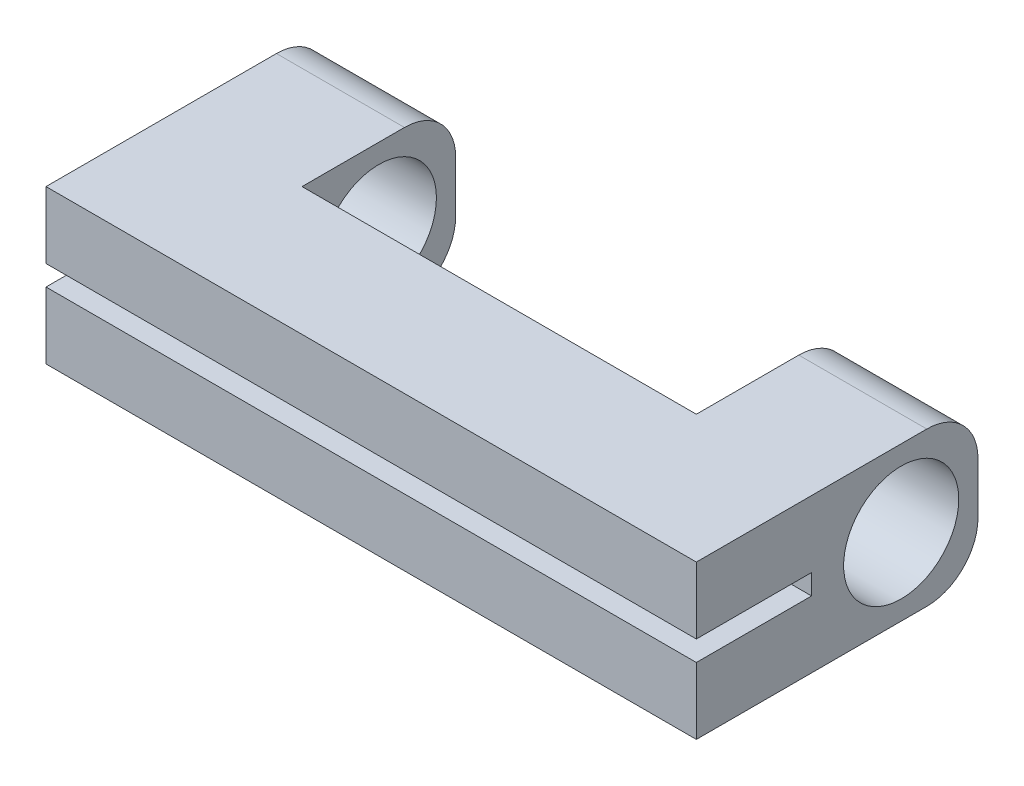
ISO-10303-21;
HEADER;
FILE_DESCRIPTION(('STEP AP214'),'2;1');
FILE_NAME('part.step','',(''),(''),'','','');
FILE_SCHEMA(('AUTOMOTIVE_DESIGN { 1 0 10303 214 1 1 1 1 }'));
ENDSEC;
DATA;
#1=APPLICATION_CONTEXT('core data for automotive mechanical design processes');
#2=APPLICATION_PROTOCOL_DEFINITION('international standard','automotive_design',2000,#1);
#3=PRODUCT_CONTEXT('',#1,'mechanical');
#4=PRODUCT('Part','Part','',(#3));
#5=PRODUCT_RELATED_PRODUCT_CATEGORY('part','',(#4));
#6=PRODUCT_DEFINITION_FORMATION('','',#4);
#7=PRODUCT_DEFINITION_CONTEXT('part definition',#1,'design');
#8=PRODUCT_DEFINITION('design','',#6,#7);
#9=PRODUCT_DEFINITION_SHAPE('','',#8);
#10=(LENGTH_UNIT() NAMED_UNIT(*) SI_UNIT(.MILLI.,.METRE.));
#11=(NAMED_UNIT(*) PLANE_ANGLE_UNIT() SI_UNIT($,.RADIAN.));
#12=(NAMED_UNIT(*) SI_UNIT($,.STERADIAN.) SOLID_ANGLE_UNIT());
#13=UNCERTAINTY_MEASURE_WITH_UNIT(LENGTH_MEASURE(1.E-05),#10,'distance_accuracy_value','');
#14=(GEOMETRIC_REPRESENTATION_CONTEXT(3) GLOBAL_UNCERTAINTY_ASSIGNED_CONTEXT((#13)) GLOBAL_UNIT_ASSIGNED_CONTEXT((#10,
#11,#12)) REPRESENTATION_CONTEXT('',''));
#15=CARTESIAN_POINT('',(0.,0.,0.));
#16=DIRECTION('',(0.,0.,1.));
#17=DIRECTION('',(1.,0.,0.));
#18=AXIS2_PLACEMENT_3D('',#15,#16,#17);
#19=CARTESIAN_POINT('',(12.7,6.,-2.5));
#20=DIRECTION('',(0.,0.,1.));
#21=DIRECTION('',(1.,0.,0.));
#22=AXIS2_PLACEMENT_3D('',#19,#20,#21);
#23=PLANE('',#22);
#24=DIRECTION('',(0.,-1.,0.));
#25=VECTOR('',#24,1.);
#26=CARTESIAN_POINT('',(7.7,0.,-2.5));
#27=LINE('',#26,#25);
#28=CARTESIAN_POINT('',(7.69999999999999,6.,-2.5));
#29=VERTEX_POINT('',#28);
#30=CARTESIAN_POINT('',(7.7,0.,-2.5));
#31=VERTEX_POINT('',#30);
#32=EDGE_CURVE('E48',#29,#31,#27,.T.);
#33=ORIENTED_EDGE('',*,*,#32,.T.);
#34=DIRECTION('',(-1.,0.,0.));
#35=VECTOR('',#34,1.);
#36=CARTESIAN_POINT('',(12.7,0.,-2.5));
#37=LINE('',#36,#35);
#38=CARTESIAN_POINT('',(-7.7,0.,-2.5));
#39=VERTEX_POINT('',#38);
#40=EDGE_CURVE('E243',#31,#39,#37,.T.);
#41=ORIENTED_EDGE('',*,*,#40,.T.);
#42=DIRECTION('',(0.,-1.,0.));
#43=VECTOR('',#42,1.);
#44=CARTESIAN_POINT('',(-7.7,0.,-2.5));
#45=LINE('',#44,#43);
#46=CARTESIAN_POINT('',(-7.69999999999999,6.,-2.5));
#47=VERTEX_POINT('',#46);
#48=EDGE_CURVE('E147',#47,#39,#45,.T.);
#49=ORIENTED_EDGE('',*,*,#48,.F.);
#50=DIRECTION('',(-1.,0.,0.));
#51=VECTOR('',#50,1.);
#52=CARTESIAN_POINT('',(12.7,6.,-2.5));
#53=LINE('',#52,#51);
#54=EDGE_CURVE('E144',#29,#47,#53,.T.);
#55=ORIENTED_EDGE('',*,*,#54,.F.);
#56=EDGE_LOOP('',(#33,#41,#49,#55));
#57=FACE_BOUND('',#56,.T.);
#58=ADVANCED_FACE('F33',(#57),#23,.F.);
#59=CARTESIAN_POINT('',(12.7,6.,2.5));
#60=DIRECTION('',(0.,0.,-1.));
#61=DIRECTION('',(-1.,0.,0.));
#62=AXIS2_PLACEMENT_3D('',#59,#60,#61);
#63=PLANE('',#62);
#64=DIRECTION('',(0.,-1.,0.));
#65=VECTOR('',#64,1.);
#66=CARTESIAN_POINT('',(12.7,6.,2.5));
#67=LINE('',#66,#65);
#68=CARTESIAN_POINT('',(12.7,2.603125,2.5));
#69=VERTEX_POINT('',#68);
#70=CARTESIAN_POINT('',(12.7,0.,2.5));
#71=VERTEX_POINT('',#70);
#72=EDGE_CURVE('E149',#69,#71,#67,.T.);
#73=ORIENTED_EDGE('',*,*,#72,.F.);
#74=DIRECTION('',(-1.,0.,0.));
#75=VECTOR('',#74,1.);
#76=CARTESIAN_POINT('',(12.7,2.603125,2.5));
#77=LINE('',#76,#75);
#78=CARTESIAN_POINT('',(-12.7,2.603125,2.5));
#79=VERTEX_POINT('',#78);
#80=EDGE_CURVE('E236',#69,#79,#77,.T.);
#81=ORIENTED_EDGE('',*,*,#80,.T.);
#82=DIRECTION('',(0.,-1.,0.));
#83=VECTOR('',#82,1.);
#84=CARTESIAN_POINT('',(-12.7,6.,2.5));
#85=LINE('',#84,#83);
#86=CARTESIAN_POINT('',(-12.7,0.,2.5));
#87=VERTEX_POINT('',#86);
#88=EDGE_CURVE('E256',#79,#87,#85,.T.);
#89=ORIENTED_EDGE('',*,*,#88,.T.);
#90=DIRECTION('',(1.,0.,0.));
#91=VECTOR('',#90,1.);
#92=CARTESIAN_POINT('',(12.7,0.,2.5));
#93=LINE('',#92,#91);
#94=EDGE_CURVE('E247',#87,#71,#93,.T.);
#95=ORIENTED_EDGE('',*,*,#94,.T.);
#96=EDGE_LOOP('',(#73,#81,#89,#95));
#97=FACE_BOUND('',#96,.T.);
#98=ADVANCED_FACE('F300',(#97),#63,.F.);
#99=CARTESIAN_POINT('',(-12.7,6.,2.5));
#100=DIRECTION('',(1.,0.,0.));
#101=DIRECTION('',(0.,0.,-1.));
#102=AXIS2_PLACEMENT_3D('',#99,#100,#101);
#103=PLANE('',#102);
#104=CARTESIAN_POINT('',(-12.7,6.,2.5));
#105=VERTEX_POINT('',#104);
#106=CARTESIAN_POINT('',(-12.7,3.396875,2.5));
#107=VERTEX_POINT('',#106);
#108=EDGE_CURVE('E257',#105,#107,#85,.T.);
#109=ORIENTED_EDGE('',*,*,#108,.F.);
#110=DIRECTION('',(0.,0.,1.));
#111=VECTOR('',#110,1.);
#112=CARTESIAN_POINT('',(-12.7,6.,2.5));
#113=LINE('',#112,#111);
#114=CARTESIAN_POINT('',(-12.7,6.,-6.5));
#115=VERTEX_POINT('',#114);
#116=EDGE_CURVE('E240',#115,#105,#113,.T.);
#117=ORIENTED_EDGE('',*,*,#116,.F.);
#118=CARTESIAN_POINT('',(-12.7,4.,-6.5));
#119=DIRECTION('',(1.,0.,0.));
#120=DIRECTION('',(0.,0.,-1.));
#121=AXIS2_PLACEMENT_3D('',#118,#119,#120);
#122=CIRCLE('',#121,2.);
#123=CARTESIAN_POINT('',(-12.7,4.,-8.5));
#124=VERTEX_POINT('',#123);
#125=EDGE_CURVE('E269',#115,#124,#122,.F.);
#126=ORIENTED_EDGE('',*,*,#125,.T.);
#127=DIRECTION('',(0.,1.,0.));
#128=VECTOR('',#127,1.);
#129=CARTESIAN_POINT('',(-12.7,0.,-8.5));
#130=LINE('',#129,#128);
#131=CARTESIAN_POINT('',(-12.7,2.,-8.5));
#132=VERTEX_POINT('',#131);
#133=EDGE_CURVE('E202',#132,#124,#130,.T.);
#134=ORIENTED_EDGE('',*,*,#133,.F.);
#135=CARTESIAN_POINT('',(-12.7,2.,-6.5));
#136=DIRECTION('',(1.,0.,0.));
#137=DIRECTION('',(0.,0.,-1.));
#138=AXIS2_PLACEMENT_3D('',#135,#136,#137);
#139=CIRCLE('',#138,2.);
#140=CARTESIAN_POINT('',(-12.7,0.,-6.5));
#141=VERTEX_POINT('',#140);
#142=EDGE_CURVE('E271',#132,#141,#139,.F.);
#143=ORIENTED_EDGE('',*,*,#142,.T.);
#144=DIRECTION('',(0.,0.,1.));
#145=VECTOR('',#144,1.);
#146=CARTESIAN_POINT('',(-12.7,0.,2.5));
#147=LINE('',#146,#145);
#148=EDGE_CURVE('E239',#141,#87,#147,.T.);
#149=ORIENTED_EDGE('',*,*,#148,.T.);
#150=ORIENTED_EDGE('',*,*,#88,.F.);
#151=DIRECTION('',(0.,0.,-1.));
#152=VECTOR('',#151,1.);
#153=CARTESIAN_POINT('',(-12.7,2.603125,7.));
#154=LINE('',#153,#152);
#155=CARTESIAN_POINT('',(-12.7,2.603125,-2.));
#156=VERTEX_POINT('',#155);
#157=EDGE_CURVE('E222',#79,#156,#154,.T.);
#158=ORIENTED_EDGE('',*,*,#157,.T.);
#159=DIRECTION('',(0.,1.,0.));
#160=VECTOR('',#159,1.);
#161=CARTESIAN_POINT('',(-12.7,2.603125,-2.));
#162=LINE('',#161,#160);
#163=CARTESIAN_POINT('',(-12.7,3.396875,-2.));
#164=VERTEX_POINT('',#163);
#165=EDGE_CURVE('E215',#156,#164,#162,.T.);
#166=ORIENTED_EDGE('',*,*,#165,.T.);
#167=DIRECTION('',(0.,0.,1.));
#168=VECTOR('',#167,1.);
#169=CARTESIAN_POINT('',(-12.7,3.396875,7.));
#170=LINE('',#169,#168);
#171=EDGE_CURVE('E218',#164,#107,#170,.T.);
#172=ORIENTED_EDGE('',*,*,#171,.T.);
#173=EDGE_LOOP('',(#109,#117,#126,#134,#143,#149,#150,#158,#166,#172));
#174=FACE_BOUND('',#173,.T.);
#175=CARTESIAN_POINT('',(-12.7,3.,-5.5));
#176=DIRECTION('',(1.,0.,0.));
#177=DIRECTION('',(0.,0.,-1.));
#178=AXIS2_PLACEMENT_3D('',#175,#176,#177);
#179=CIRCLE('',#178,2.2479);
#180=CARTESIAN_POINT('',(-12.7,3.,-7.7479));
#181=VERTEX_POINT('',#180);
#182=EDGE_CURVE('E199',#181,#181,#179,.T.);
#183=ORIENTED_EDGE('',*,*,#182,.T.);
#184=EDGE_LOOP('',(#183));
#185=FACE_BOUND('',#184,.T.);
#186=ADVANCED_FACE('F289',(#174,#185),#103,.F.);
#187=ORIENTED_EDGE('',*,*,#108,.T.);
#188=DIRECTION('',(1.,0.,0.));
#189=VECTOR('',#188,1.);
#190=CARTESIAN_POINT('',(12.7,3.396875,2.5));
#191=LINE('',#190,#189);
#192=CARTESIAN_POINT('',(12.7,3.396875,2.5));
#193=VERTEX_POINT('',#192);
#194=EDGE_CURVE('E231',#107,#193,#191,.T.);
#195=ORIENTED_EDGE('',*,*,#194,.T.);
#196=CARTESIAN_POINT('',(12.7,6.,2.5));
#197=VERTEX_POINT('',#196);
#198=EDGE_CURVE('E253',#197,#193,#67,.T.);
#199=ORIENTED_EDGE('',*,*,#198,.F.);
#200=DIRECTION('',(1.,0.,0.));
#201=VECTOR('',#200,1.);
#202=CARTESIAN_POINT('',(12.7,6.,2.5));
#203=LINE('',#202,#201);
#204=EDGE_CURVE('E242',#105,#197,#203,.T.);
#205=ORIENTED_EDGE('',*,*,#204,.F.);
#206=EDGE_LOOP('',(#187,#195,#199,#205));
#207=FACE_BOUND('',#206,.T.);
#208=ADVANCED_FACE('F314',(#207),#63,.F.);
#209=CARTESIAN_POINT('',(12.7,6.,2.5));
#210=DIRECTION('',(-1.,0.,0.));
#211=DIRECTION('',(0.,0.,1.));
#212=AXIS2_PLACEMENT_3D('',#209,#210,#211);
#213=PLANE('',#212);
#214=DIRECTION('',(0.,1.,0.));
#215=VECTOR('',#214,1.);
#216=CARTESIAN_POINT('',(12.7,2.603125,-2.));
#217=LINE('',#216,#215);
#218=CARTESIAN_POINT('',(12.7,2.603125,-2.));
#219=VERTEX_POINT('',#218);
#220=CARTESIAN_POINT('',(12.7,3.396875,-2.));
#221=VERTEX_POINT('',#220);
#222=EDGE_CURVE('E214',#219,#221,#217,.T.);
#223=ORIENTED_EDGE('',*,*,#222,.F.);
#224=DIRECTION('',(0.,0.,1.));
#225=VECTOR('',#224,1.);
#226=CARTESIAN_POINT('',(12.7,2.603125,2.5));
#227=LINE('',#226,#225);
#228=EDGE_CURVE('E260',#219,#69,#227,.T.);
#229=ORIENTED_EDGE('',*,*,#228,.T.);
#230=ORIENTED_EDGE('',*,*,#72,.T.);
#231=DIRECTION('',(0.,0.,-1.));
#232=VECTOR('',#231,1.);
#233=CARTESIAN_POINT('',(12.7,0.,2.5));
#234=LINE('',#233,#232);
#235=CARTESIAN_POINT('',(12.7,0.,-6.5));
#236=VERTEX_POINT('',#235);
#237=EDGE_CURVE('E250',#71,#236,#234,.T.);
#238=ORIENTED_EDGE('',*,*,#237,.T.);
#239=CARTESIAN_POINT('',(12.7,2.,-6.5));
#240=DIRECTION('',(1.,0.,0.));
#241=DIRECTION('',(0.,0.,-1.));
#242=AXIS2_PLACEMENT_3D('',#239,#240,#241);
#243=CIRCLE('',#242,2.);
#244=CARTESIAN_POINT('',(12.7,2.,-8.5));
#245=VERTEX_POINT('',#244);
#246=EDGE_CURVE('E184',#245,#236,#243,.F.);
#247=ORIENTED_EDGE('',*,*,#246,.F.);
#248=DIRECTION('',(0.,1.,0.));
#249=VECTOR('',#248,1.);
#250=CARTESIAN_POINT('',(12.7,0.,-8.5));
#251=LINE('',#250,#249);
#252=CARTESIAN_POINT('',(12.7,4.,-8.5));
#253=VERTEX_POINT('',#252);
#254=EDGE_CURVE('E166',#245,#253,#251,.T.);
#255=ORIENTED_EDGE('',*,*,#254,.T.);
#256=CARTESIAN_POINT('',(12.7,4.,-6.5));
#257=DIRECTION('',(1.,0.,0.));
#258=DIRECTION('',(0.,0.,-1.));
#259=AXIS2_PLACEMENT_3D('',#256,#257,#258);
#260=CIRCLE('',#259,2.);
#261=CARTESIAN_POINT('',(12.7,6.,-6.5));
#262=VERTEX_POINT('',#261);
#263=EDGE_CURVE('E181',#262,#253,#260,.F.);
#264=ORIENTED_EDGE('',*,*,#263,.F.);
#265=DIRECTION('',(0.,0.,-1.));
#266=VECTOR('',#265,1.);
#267=CARTESIAN_POINT('',(12.7,6.,2.5));
#268=LINE('',#267,#266);
#269=EDGE_CURVE('E150',#197,#262,#268,.T.);
#270=ORIENTED_EDGE('',*,*,#269,.F.);
#271=ORIENTED_EDGE('',*,*,#198,.T.);
#272=DIRECTION('',(0.,0.,1.));
#273=VECTOR('',#272,1.);
#274=CARTESIAN_POINT('',(12.7,3.396875,7.));
#275=LINE('',#274,#273);
#276=EDGE_CURVE('E219',#221,#193,#275,.T.);
#277=ORIENTED_EDGE('',*,*,#276,.F.);
#278=EDGE_LOOP('',(#223,#229,#230,#238,#247,#255,#264,#270,#271,#277));
#279=FACE_BOUND('',#278,.T.);
#280=CARTESIAN_POINT('',(12.7,3.,-5.5));
#281=DIRECTION('',(1.,0.,0.));
#282=DIRECTION('',(0.,0.,-1.));
#283=AXIS2_PLACEMENT_3D('',#280,#281,#282);
#284=CIRCLE('',#283,2.2479);
#285=CARTESIAN_POINT('',(12.7,3.,-7.7479));
#286=VERTEX_POINT('',#285);
#287=EDGE_CURVE('E167',#286,#286,#284,.T.);
#288=ORIENTED_EDGE('',*,*,#287,.F.);
#289=EDGE_LOOP('',(#288));
#290=FACE_BOUND('',#289,.T.);
#291=ADVANCED_FACE('F338',(#279,#290),#213,.F.);
#292=CARTESIAN_POINT('',(0.,6.,0.));
#293=DIRECTION('',(0.,1.,0.));
#294=DIRECTION('',(0.,0.,1.));
#295=AXIS2_PLACEMENT_3D('',#292,#293,#294);
#296=PLANE('',#295);
#297=ORIENTED_EDGE('',*,*,#54,.T.);
#298=DIRECTION('',(0.,0.,1.));
#299=VECTOR('',#298,1.);
#300=CARTESIAN_POINT('',(-7.7,6.,-8.5));
#301=LINE('',#300,#299);
#302=CARTESIAN_POINT('',(-7.7,6.,-6.5));
#303=VERTEX_POINT('',#302);
#304=EDGE_CURVE('E212',#303,#47,#301,.T.);
#305=ORIENTED_EDGE('',*,*,#304,.F.);
#306=DIRECTION('',(1.,0.,0.));
#307=VECTOR('',#306,1.);
#308=CARTESIAN_POINT('',(-12.7,6.,-6.5));
#309=LINE('',#308,#307);
#310=EDGE_CURVE('E11',#303,#115,#309,.F.);
#311=ORIENTED_EDGE('',*,*,#310,.T.);
#312=ORIENTED_EDGE('',*,*,#116,.T.);
#313=ORIENTED_EDGE('',*,*,#204,.T.);
#314=ORIENTED_EDGE('',*,*,#269,.T.);
#315=DIRECTION('',(-1.,0.,0.));
#316=VECTOR('',#315,1.);
#317=CARTESIAN_POINT('',(12.7,6.,-6.5));
#318=LINE('',#317,#316);
#319=CARTESIAN_POINT('',(7.7,6.,-6.5));
#320=VERTEX_POINT('',#319);
#321=EDGE_CURVE('E157',#320,#262,#318,.F.);
#322=ORIENTED_EDGE('',*,*,#321,.F.);
#323=DIRECTION('',(0.,0.,1.));
#324=VECTOR('',#323,1.);
#325=CARTESIAN_POINT('',(7.7,6.,-8.5));
#326=LINE('',#325,#324);
#327=EDGE_CURVE('E154',#320,#29,#326,.T.);
#328=ORIENTED_EDGE('',*,*,#327,.T.);
#329=EDGE_LOOP('',(#297,#305,#311,#312,#313,#314,#322,#328));
#330=FACE_BOUND('',#329,.T.);
#331=ADVANCED_FACE('F155',(#330),#296,.T.);
#332=CARTESIAN_POINT('',(0.,0.,0.));
#333=DIRECTION('',(0.,1.,0.));
#334=DIRECTION('',(0.,0.,1.));
#335=AXIS2_PLACEMENT_3D('',#332,#333,#334);
#336=PLANE('',#335);
#337=ORIENTED_EDGE('',*,*,#94,.F.);
#338=ORIENTED_EDGE('',*,*,#148,.F.);
#339=DIRECTION('',(-1.,0.,0.));
#340=VECTOR('',#339,1.);
#341=CARTESIAN_POINT('',(0.,0.,-6.5));
#342=LINE('',#341,#340);
#343=CARTESIAN_POINT('',(-7.7,0.,-6.5));
#344=VERTEX_POINT('',#343);
#345=EDGE_CURVE('E273',#141,#344,#342,.F.);
#346=ORIENTED_EDGE('',*,*,#345,.T.);
#347=DIRECTION('',(0.,0.,1.));
#348=VECTOR('',#347,1.);
#349=CARTESIAN_POINT('',(-7.7,0.,-8.5));
#350=LINE('',#349,#348);
#351=EDGE_CURVE('E208',#344,#39,#350,.T.);
#352=ORIENTED_EDGE('',*,*,#351,.T.);
#353=ORIENTED_EDGE('',*,*,#40,.F.);
#354=DIRECTION('',(0.,0.,1.));
#355=VECTOR('',#354,1.);
#356=CARTESIAN_POINT('',(7.7,0.,-8.5));
#357=LINE('',#356,#355);
#358=CARTESIAN_POINT('',(7.7,0.,-6.5));
#359=VERTEX_POINT('',#358);
#360=EDGE_CURVE('E161',#359,#31,#357,.T.);
#361=ORIENTED_EDGE('',*,*,#360,.F.);
#362=DIRECTION('',(1.,0.,0.));
#363=VECTOR('',#362,1.);
#364=CARTESIAN_POINT('',(0.,0.,-6.5));
#365=LINE('',#364,#363);
#366=EDGE_CURVE('E187',#236,#359,#365,.F.);
#367=ORIENTED_EDGE('',*,*,#366,.F.);
#368=ORIENTED_EDGE('',*,*,#237,.F.);
#369=EDGE_LOOP('',(#337,#338,#346,#352,#353,#361,#367,#368));
#370=FACE_BOUND('',#369,.T.);
#371=ADVANCED_FACE('F295',(#370),#336,.F.);
#372=CARTESIAN_POINT('',(-12.7,2.603125,7.));
#373=DIRECTION('',(0.,-1.,0.));
#374=DIRECTION('',(0.,0.,-1.));
#375=AXIS2_PLACEMENT_3D('',#372,#373,#374);
#376=PLANE('',#375);
#377=ORIENTED_EDGE('',*,*,#228,.F.);
#378=DIRECTION('',(1.,0.,0.));
#379=VECTOR('',#378,1.);
#380=CARTESIAN_POINT('',(-12.7,2.603125,-2.));
#381=LINE('',#380,#379);
#382=EDGE_CURVE('E228',#156,#219,#381,.T.);
#383=ORIENTED_EDGE('',*,*,#382,.F.);
#384=ORIENTED_EDGE('',*,*,#157,.F.);
#385=ORIENTED_EDGE('',*,*,#80,.F.);
#386=EDGE_LOOP('',(#377,#383,#384,#385));
#387=FACE_BOUND('',#386,.T.);
#388=ADVANCED_FACE('F303',(#387),#376,.F.);
#389=CARTESIAN_POINT('',(-12.7,3.396875,7.));
#390=DIRECTION('',(0.,1.,0.));
#391=DIRECTION('',(0.,0.,1.));
#392=AXIS2_PLACEMENT_3D('',#389,#390,#391);
#393=PLANE('',#392);
#394=ORIENTED_EDGE('',*,*,#171,.F.);
#395=DIRECTION('',(1.,0.,0.));
#396=VECTOR('',#395,1.);
#397=CARTESIAN_POINT('',(-12.7,3.396875,-2.));
#398=LINE('',#397,#396);
#399=EDGE_CURVE('E225',#164,#221,#398,.T.);
#400=ORIENTED_EDGE('',*,*,#399,.T.);
#401=ORIENTED_EDGE('',*,*,#276,.T.);
#402=ORIENTED_EDGE('',*,*,#194,.F.);
#403=EDGE_LOOP('',(#394,#400,#401,#402));
#404=FACE_BOUND('',#403,.T.);
#405=ADVANCED_FACE('F310',(#404),#393,.F.);
#406=CARTESIAN_POINT('',(-12.7,2.603125,-2.));
#407=DIRECTION('',(0.,0.,-1.));
#408=DIRECTION('',(-1.,0.,0.));
#409=AXIS2_PLACEMENT_3D('',#406,#407,#408);
#410=PLANE('',#409);
#411=ORIENTED_EDGE('',*,*,#222,.T.);
#412=ORIENTED_EDGE('',*,*,#399,.F.);
#413=ORIENTED_EDGE('',*,*,#165,.F.);
#414=ORIENTED_EDGE('',*,*,#382,.T.);
#415=EDGE_LOOP('',(#411,#412,#413,#414));
#416=FACE_BOUND('',#415,.T.);
#417=ADVANCED_FACE('F306',(#416),#410,.F.);
#418=CARTESIAN_POINT('',(-7.7,0.,-8.5));
#419=DIRECTION('',(-1.,0.,0.));
#420=DIRECTION('',(0.,0.,1.));
#421=AXIS2_PLACEMENT_3D('',#418,#419,#420);
#422=PLANE('',#421);
#423=CARTESIAN_POINT('',(-7.7,3.,-5.5));
#424=DIRECTION('',(1.,0.,0.));
#425=DIRECTION('',(0.,0.,-1.));
#426=AXIS2_PLACEMENT_3D('',#423,#424,#425);
#427=CIRCLE('',#426,2.2479);
#428=CARTESIAN_POINT('',(-7.7,3.,-7.7479));
#429=VERTEX_POINT('',#428);
#430=EDGE_CURVE('E196',#429,#429,#427,.T.);
#431=ORIENTED_EDGE('',*,*,#430,.F.);
#432=EDGE_LOOP('',(#431));
#433=FACE_BOUND('',#432,.T.);
#434=ORIENTED_EDGE('',*,*,#351,.F.);
#435=CARTESIAN_POINT('',(-7.7,2.,-6.5));
#436=DIRECTION('',(-1.,0.,0.));
#437=DIRECTION('',(0.,0.,1.));
#438=AXIS2_PLACEMENT_3D('',#435,#436,#437);
#439=CIRCLE('',#438,2.);
#440=CARTESIAN_POINT('',(-7.7,2.,-8.5));
#441=VERTEX_POINT('',#440);
#442=EDGE_CURVE('E41',#344,#441,#439,.F.);
#443=ORIENTED_EDGE('',*,*,#442,.T.);
#444=DIRECTION('',(0.,-1.,0.));
#445=VECTOR('',#444,1.);
#446=CARTESIAN_POINT('',(-7.7,0.,-8.5));
#447=LINE('',#446,#445);
#448=CARTESIAN_POINT('',(-7.7,4.,-8.5));
#449=VERTEX_POINT('',#448);
#450=EDGE_CURVE('E205',#449,#441,#447,.T.);
#451=ORIENTED_EDGE('',*,*,#450,.F.);
#452=CARTESIAN_POINT('',(-7.7,4.,-6.5));
#453=DIRECTION('',(-1.,0.,0.));
#454=DIRECTION('',(0.,0.,1.));
#455=AXIS2_PLACEMENT_3D('',#452,#453,#454);
#456=CIRCLE('',#455,2.);
#457=EDGE_CURVE('E56',#449,#303,#456,.F.);
#458=ORIENTED_EDGE('',*,*,#457,.T.);
#459=ORIENTED_EDGE('',*,*,#304,.T.);
#460=ORIENTED_EDGE('',*,*,#48,.T.);
#461=EDGE_LOOP('',(#434,#443,#451,#458,#459,#460));
#462=FACE_BOUND('',#461,.T.);
#463=ADVANCED_FACE('F277',(#433,#462),#422,.F.);
#464=CARTESIAN_POINT('',(0.,0.,-8.5));
#465=DIRECTION('',(0.,0.,1.));
#466=DIRECTION('',(1.,0.,0.));
#467=AXIS2_PLACEMENT_3D('',#464,#465,#466);
#468=PLANE('',#467);
#469=ORIENTED_EDGE('',*,*,#450,.T.);
#470=DIRECTION('',(-1.,0.,0.));
#471=VECTOR('',#470,1.);
#472=CARTESIAN_POINT('',(0.,2.,-8.5));
#473=LINE('',#472,#471);
#474=EDGE_CURVE('E266',#441,#132,#473,.T.);
#475=ORIENTED_EDGE('',*,*,#474,.T.);
#476=ORIENTED_EDGE('',*,*,#133,.T.);
#477=DIRECTION('',(1.,0.,0.));
#478=VECTOR('',#477,1.);
#479=CARTESIAN_POINT('',(-7.7,4.,-8.5));
#480=LINE('',#479,#478);
#481=EDGE_CURVE('E263',#124,#449,#480,.T.);
#482=ORIENTED_EDGE('',*,*,#481,.T.);
#483=EDGE_LOOP('',(#469,#475,#476,#482));
#484=FACE_BOUND('',#483,.T.);
#485=ADVANCED_FACE('F282',(#484),#468,.F.);
#486=CARTESIAN_POINT('',(-7.7,3.,-5.5));
#487=DIRECTION('',(1.,0.,0.));
#488=DIRECTION('',(0.,0.,-1.));
#489=AXIS2_PLACEMENT_3D('',#486,#487,#488);
#490=CYLINDRICAL_SURFACE('',#489,2.2479);
#491=ORIENTED_EDGE('',*,*,#182,.F.);
#492=EDGE_LOOP('',(#491));
#493=FACE_BOUND('',#492,.T.);
#494=ORIENTED_EDGE('',*,*,#430,.T.);
#495=EDGE_LOOP('',(#494));
#496=FACE_BOUND('',#495,.T.);
#497=ADVANCED_FACE('F328',(#493,#496),#490,.F.);
#498=CARTESIAN_POINT('',(0.,2.,-6.5));
#499=DIRECTION('',(-1.,0.,0.));
#500=DIRECTION('',(0.,0.,1.));
#501=AXIS2_PLACEMENT_3D('',#498,#499,#500);
#502=CYLINDRICAL_SURFACE('',#501,2.);
#503=ORIENTED_EDGE('',*,*,#442,.F.);
#504=ORIENTED_EDGE('',*,*,#345,.F.);
#505=ORIENTED_EDGE('',*,*,#142,.F.);
#506=ORIENTED_EDGE('',*,*,#474,.F.);
#507=EDGE_LOOP('',(#503,#504,#505,#506));
#508=FACE_BOUND('',#507,.T.);
#509=ADVANCED_FACE('F285',(#508),#502,.T.);
#510=CARTESIAN_POINT('',(0.,4.,-6.5));
#511=DIRECTION('',(-1.,0.,0.));
#512=DIRECTION('',(0.,0.,1.));
#513=AXIS2_PLACEMENT_3D('',#510,#511,#512);
#514=CYLINDRICAL_SURFACE('',#513,2.);
#515=ORIENTED_EDGE('',*,*,#125,.F.);
#516=ORIENTED_EDGE('',*,*,#310,.F.);
#517=ORIENTED_EDGE('',*,*,#457,.F.);
#518=ORIENTED_EDGE('',*,*,#481,.F.);
#519=EDGE_LOOP('',(#515,#516,#517,#518));
#520=FACE_BOUND('',#519,.T.);
#521=ADVANCED_FACE('F35',(#520),#514,.T.);
#522=CARTESIAN_POINT('',(7.7,0.,-8.5));
#523=DIRECTION('',(1.,0.,0.));
#524=DIRECTION('',(0.,0.,1.));
#525=AXIS2_PLACEMENT_3D('',#522,#523,#524);
#526=PLANE('',#525);
#527=CARTESIAN_POINT('',(7.7,3.,-5.5));
#528=DIRECTION('',(1.,0.,0.));
#529=DIRECTION('',(0.,0.,-1.));
#530=AXIS2_PLACEMENT_3D('',#527,#528,#529);
#531=CIRCLE('',#530,2.2479);
#532=CARTESIAN_POINT('',(7.7,3.,-7.7479));
#533=VERTEX_POINT('',#532);
#534=EDGE_CURVE('E173',#533,#533,#531,.T.);
#535=ORIENTED_EDGE('',*,*,#534,.T.);
#536=EDGE_LOOP('',(#535));
#537=FACE_BOUND('',#536,.T.);
#538=ORIENTED_EDGE('',*,*,#360,.T.);
#539=ORIENTED_EDGE('',*,*,#32,.F.);
#540=ORIENTED_EDGE('',*,*,#327,.F.);
#541=CARTESIAN_POINT('',(7.7,4.,-6.5));
#542=DIRECTION('',(-1.,0.,0.));
#543=DIRECTION('',(0.,0.,1.));
#544=AXIS2_PLACEMENT_3D('',#541,#542,#543);
#545=CIRCLE('',#544,2.);
#546=CARTESIAN_POINT('',(7.7,4.,-8.5));
#547=VERTEX_POINT('',#546);
#548=EDGE_CURVE('E190',#547,#320,#545,.F.);
#549=ORIENTED_EDGE('',*,*,#548,.F.);
#550=DIRECTION('',(0.,-1.,0.));
#551=VECTOR('',#550,1.);
#552=CARTESIAN_POINT('',(7.7,0.,-8.5));
#553=LINE('',#552,#551);
#554=CARTESIAN_POINT('',(7.7,2.,-8.5));
#555=VERTEX_POINT('',#554);
#556=EDGE_CURVE('E170',#547,#555,#553,.T.);
#557=ORIENTED_EDGE('',*,*,#556,.T.);
#558=CARTESIAN_POINT('',(7.7,2.,-6.5));
#559=DIRECTION('',(-1.,0.,0.));
#560=DIRECTION('',(0.,0.,1.));
#561=AXIS2_PLACEMENT_3D('',#558,#559,#560);
#562=CIRCLE('',#561,2.);
#563=EDGE_CURVE('E192',#359,#555,#562,.F.);
#564=ORIENTED_EDGE('',*,*,#563,.F.);
#565=EDGE_LOOP('',(#538,#539,#540,#549,#557,#564));
#566=FACE_BOUND('',#565,.T.);
#567=ADVANCED_FACE('F164',(#537,#566),#526,.F.);
#568=CARTESIAN_POINT('',(0.,0.,-8.5));
#569=DIRECTION('',(0.,0.,1.));
#570=DIRECTION('',(-1.,0.,0.));
#571=AXIS2_PLACEMENT_3D('',#568,#569,#570);
#572=PLANE('',#571);
#573=ORIENTED_EDGE('',*,*,#556,.F.);
#574=DIRECTION('',(-1.,0.,0.));
#575=VECTOR('',#574,1.);
#576=CARTESIAN_POINT('',(7.7,4.,-8.5));
#577=LINE('',#576,#575);
#578=EDGE_CURVE('E160',#253,#547,#577,.T.);
#579=ORIENTED_EDGE('',*,*,#578,.F.);
#580=ORIENTED_EDGE('',*,*,#254,.F.);
#581=DIRECTION('',(1.,0.,0.));
#582=VECTOR('',#581,1.);
#583=CARTESIAN_POINT('',(0.,2.,-8.5));
#584=LINE('',#583,#582);
#585=EDGE_CURVE('E179',#555,#245,#584,.T.);
#586=ORIENTED_EDGE('',*,*,#585,.F.);
#587=EDGE_LOOP('',(#573,#579,#580,#586));
#588=FACE_BOUND('',#587,.T.);
#589=ADVANCED_FACE('F325',(#588),#572,.F.);
#590=CARTESIAN_POINT('',(7.7,3.,-5.5));
#591=DIRECTION('',(-1.,0.,0.));
#592=DIRECTION('',(0.,0.,-1.));
#593=AXIS2_PLACEMENT_3D('',#590,#591,#592);
#594=CYLINDRICAL_SURFACE('',#593,2.2479);
#595=ORIENTED_EDGE('',*,*,#287,.T.);
#596=EDGE_LOOP('',(#595));
#597=FACE_BOUND('',#596,.T.);
#598=ORIENTED_EDGE('',*,*,#534,.F.);
#599=EDGE_LOOP('',(#598));
#600=FACE_BOUND('',#599,.T.);
#601=ADVANCED_FACE('F472',(#597,#600),#594,.F.);
#602=CARTESIAN_POINT('',(0.,2.,-6.5));
#603=DIRECTION('',(1.,0.,0.));
#604=DIRECTION('',(0.,0.,1.));
#605=AXIS2_PLACEMENT_3D('',#602,#603,#604);
#606=CYLINDRICAL_SURFACE('',#605,2.);
#607=ORIENTED_EDGE('',*,*,#563,.T.);
#608=ORIENTED_EDGE('',*,*,#585,.T.);
#609=ORIENTED_EDGE('',*,*,#246,.T.);
#610=ORIENTED_EDGE('',*,*,#366,.T.);
#611=EDGE_LOOP('',(#607,#608,#609,#610));
#612=FACE_BOUND('',#611,.T.);
#613=ADVANCED_FACE('F481',(#612),#606,.T.);
#614=CARTESIAN_POINT('',(0.,4.,-6.5));
#615=DIRECTION('',(1.,0.,0.));
#616=DIRECTION('',(0.,0.,1.));
#617=AXIS2_PLACEMENT_3D('',#614,#615,#616);
#618=CYLINDRICAL_SURFACE('',#617,2.);
#619=ORIENTED_EDGE('',*,*,#263,.T.);
#620=ORIENTED_EDGE('',*,*,#578,.T.);
#621=ORIENTED_EDGE('',*,*,#548,.T.);
#622=ORIENTED_EDGE('',*,*,#321,.T.);
#623=EDGE_LOOP('',(#619,#620,#621,#622));
#624=FACE_BOUND('',#623,.T.);
#625=ADVANCED_FACE('F490',(#624),#618,.T.);
#626=CLOSED_SHELL('',(#58,#98,#186,#208,#291,#331,#371,#388,#405,#417,#463,#485,#497,#509,#521,
#567,#589,#601,#613,#625));
#627=MANIFOLD_SOLID_BREP('B2',#626);
#628=ADVANCED_BREP_SHAPE_REPRESENTATION('',(#18,#627),#14);
#629=SHAPE_DEFINITION_REPRESENTATION(#9,#628);
ENDSEC;
END-ISO-10303-21;
